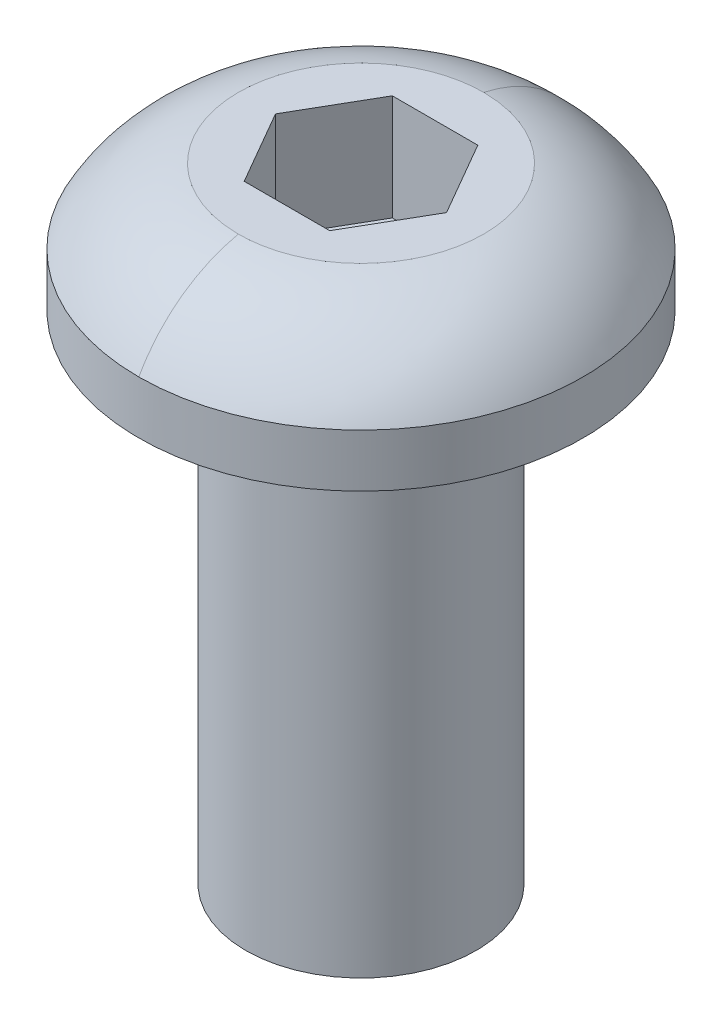
ISO-10303-21;
HEADER;
FILE_DESCRIPTION(('STEP AP214'),'2;1');
FILE_NAME('part.step','',(''),(''),'','','');
FILE_SCHEMA(('AUTOMOTIVE_DESIGN { 1 0 10303 214 1 1 1 1 }'));
ENDSEC;
DATA;
#1=APPLICATION_CONTEXT('core data for automotive mechanical design processes');
#2=APPLICATION_PROTOCOL_DEFINITION('international standard','automotive_design',2000,#1);
#3=PRODUCT_CONTEXT('',#1,'mechanical');
#4=PRODUCT('Part','Part','',(#3));
#5=PRODUCT_RELATED_PRODUCT_CATEGORY('part','',(#4));
#6=PRODUCT_DEFINITION_FORMATION('','',#4);
#7=PRODUCT_DEFINITION_CONTEXT('part definition',#1,'design');
#8=PRODUCT_DEFINITION('design','',#6,#7);
#9=PRODUCT_DEFINITION_SHAPE('','',#8);
#10=(LENGTH_UNIT() NAMED_UNIT(*) SI_UNIT(.MILLI.,.METRE.));
#11=(NAMED_UNIT(*) PLANE_ANGLE_UNIT() SI_UNIT($,.RADIAN.));
#12=(NAMED_UNIT(*) SI_UNIT($,.STERADIAN.) SOLID_ANGLE_UNIT());
#13=UNCERTAINTY_MEASURE_WITH_UNIT(LENGTH_MEASURE(1.E-05),#10,'distance_accuracy_value','');
#14=(GEOMETRIC_REPRESENTATION_CONTEXT(3) GLOBAL_UNCERTAINTY_ASSIGNED_CONTEXT((#13)) GLOBAL_UNIT_ASSIGNED_CONTEXT((#10,
#11,#12)) REPRESENTATION_CONTEXT('',''));
#15=CARTESIAN_POINT('',(0.,0.,0.));
#16=DIRECTION('',(0.,0.,1.));
#17=DIRECTION('',(1.,0.,0.));
#18=AXIS2_PLACEMENT_3D('',#15,#16,#17);
#19=CARTESIAN_POINT('',(-1.4009116,0.,-1.4009116));
#20=DIRECTION('',(0.,1.,0.));
#21=DIRECTION('',(0.,0.,1.));
#22=AXIS2_PLACEMENT_3D('',#19,#20,#21);
#23=PLANE('',#22);
#24=CARTESIAN_POINT('',(0.,0.,0.));
#25=DIRECTION('',(0.,1.,0.));
#26=DIRECTION('',(0.,0.,1.));
#27=AXIS2_PLACEMENT_3D('',#24,#25,#26);
#28=CIRCLE('',#27,1.3843);
#29=CARTESIAN_POINT('',(0.,0.,1.3843));
#30=VERTEX_POINT('',#29);
#31=EDGE_CURVE('E21',#30,#30,#28,.F.);
#32=ORIENTED_EDGE('',*,*,#31,.T.);
#33=EDGE_LOOP('',(#32));
#34=FACE_BOUND('',#33,.T.);
#35=ADVANCED_FACE('F16',(#34),#23,.F.);
#36=CARTESIAN_POINT('',(0.,0.,0.));
#37=DIRECTION('',(0.,1.,0.));
#38=DIRECTION('',(0.,0.,1.));
#39=AXIS2_PLACEMENT_3D('',#36,#37,#38);
#40=CYLINDRICAL_SURFACE('',#39,1.3843);
#41=CARTESIAN_POINT('',(0.,5.969,0.));
#42=DIRECTION('',(0.,1.,0.));
#43=DIRECTION('',(0.,0.,1.));
#44=AXIS2_PLACEMENT_3D('',#41,#42,#43);
#45=CIRCLE('',#44,1.3843);
#46=CARTESIAN_POINT('',(0.,5.969,1.3843));
#47=VERTEX_POINT('',#46);
#48=EDGE_CURVE('E156',#47,#47,#45,.F.);
#49=ORIENTED_EDGE('',*,*,#48,.T.);
#50=EDGE_LOOP('',(#49));
#51=FACE_BOUND('',#50,.T.);
#52=ORIENTED_EDGE('',*,*,#31,.F.);
#53=EDGE_LOOP('',(#52));
#54=FACE_BOUND('',#53,.T.);
#55=ADVANCED_FACE('F141',(#51,#54),#40,.T.);
#56=CARTESIAN_POINT('',(-1.026528779,6.223,-0.889));
#57=DIRECTION('',(0.,1.,0.));
#58=DIRECTION('',(0.,0.,1.));
#59=AXIS2_PLACEMENT_3D('',#56,#57,#58);
#60=PLANE('',#59);
#61=DIRECTION('',(-0.500000000504435,0.,-0.866025403493203));
#62=VECTOR('',#61,1.);
#63=CARTESIAN_POINT('',(0.769896584,6.223,-0.4445));
#64=LINE('',#63,#62);
#65=CARTESIAN_POINT('',(1.02652877885654,6.223,2.48483078188998E-10));
#66=VERTEX_POINT('',#65);
#67=CARTESIAN_POINT('',(0.513264389125,6.223,-0.889));
#68=VERTEX_POINT('',#67);
#69=EDGE_CURVE('E315',#66,#68,#64,.T.);
#70=ORIENTED_EDGE('',*,*,#69,.T.);
#71=DIRECTION('',(-1.,0.,0.));
#72=VECTOR('',#71,1.);
#73=CARTESIAN_POINT('',(0.,6.223,-0.889));
#74=LINE('',#73,#72);
#75=CARTESIAN_POINT('',(-0.513264389125,6.223,-0.889));
#76=VERTEX_POINT('',#75);
#77=EDGE_CURVE('E310',#68,#76,#74,.T.);
#78=ORIENTED_EDGE('',*,*,#77,.T.);
#79=DIRECTION('',(-0.500000000504435,0.,0.866025403493203));
#80=VECTOR('',#79,1.);
#81=CARTESIAN_POINT('',(-0.769896584,6.223,-0.4445));
#82=LINE('',#81,#80);
#83=CARTESIAN_POINT('',(-1.02652877885654,6.223,-2.48483064636471E-10));
#84=VERTEX_POINT('',#83);
#85=EDGE_CURVE('E86',#76,#84,#82,.T.);
#86=ORIENTED_EDGE('',*,*,#85,.T.);
#87=DIRECTION('',(0.500000000504435,0.,0.866025403493203));
#88=VECTOR('',#87,1.);
#89=CARTESIAN_POINT('',(-0.769896584,6.223,0.4445));
#90=LINE('',#89,#88);
#91=CARTESIAN_POINT('',(-0.51326438925,6.223,0.889));
#92=VERTEX_POINT('',#91);
#93=EDGE_CURVE('E80',#84,#92,#90,.T.);
#94=ORIENTED_EDGE('',*,*,#93,.T.);
#95=DIRECTION('',(1.,0.,0.));
#96=VECTOR('',#95,1.);
#97=CARTESIAN_POINT('',(0.,6.223,0.889));
#98=LINE('',#97,#96);
#99=CARTESIAN_POINT('',(0.513264389125,6.223,0.889));
#100=VERTEX_POINT('',#99);
#101=EDGE_CURVE('E83',#92,#100,#98,.T.);
#102=ORIENTED_EDGE('',*,*,#101,.T.);
#103=DIRECTION('',(0.500000000504435,0.,-0.866025403493203));
#104=VECTOR('',#103,1.);
#105=CARTESIAN_POINT('',(0.769896584,6.223,0.4445));
#106=LINE('',#105,#104);
#107=EDGE_CURVE('E316',#100,#66,#106,.T.);
#108=ORIENTED_EDGE('',*,*,#107,.T.);
#109=EDGE_LOOP('',(#70,#78,#86,#94,#102,#108));
#110=FACE_BOUND('',#109,.T.);
#111=ADVANCED_FACE('F82',(#110),#60,.T.);
#112=CARTESIAN_POINT('',(-2.699004,5.969,-2.699004));
#113=DIRECTION('',(0.,1.,0.));
#114=DIRECTION('',(0.,0.,1.));
#115=AXIS2_PLACEMENT_3D('',#112,#113,#114);
#116=PLANE('',#115);
#117=ORIENTED_EDGE('',*,*,#48,.F.);
#118=EDGE_LOOP('',(#117));
#119=FACE_BOUND('',#118,.T.);
#120=CARTESIAN_POINT('',(0.,5.969,0.));
#121=DIRECTION('',(0.,1.,0.));
#122=DIRECTION('',(-1.,0.,0.));
#123=AXIS2_PLACEMENT_3D('',#120,#121,#122);
#124=CIRCLE('',#123,2.667);
#125=CARTESIAN_POINT('',(-2.667,5.969,0.));
#126=VERTEX_POINT('',#125);
#127=EDGE_CURVE('E105',#126,#126,#124,.F.);
#128=ORIENTED_EDGE('',*,*,#127,.T.);
#129=EDGE_LOOP('',(#128));
#130=FACE_BOUND('',#129,.T.);
#131=ADVANCED_FACE('F140',(#119,#130),#116,.F.);
#132=CARTESIAN_POINT('',(0.,7.493,-1.4732));
#133=CARTESIAN_POINT('',(-2.9464,7.493,-1.4732));
#134=CARTESIAN_POINT('',(-2.9464,7.493,1.4732));
#135=CARTESIAN_POINT('',(0.,7.493,1.4732));
#136=CARTESIAN_POINT('',(0.,7.383079007,-1.989919522));
#137=CARTESIAN_POINT('',(-3.979839045,7.383079007,-1.989919522));
#138=CARTESIAN_POINT('',(-3.979839045,7.383079007,1.989919522));
#139=CARTESIAN_POINT('',(0.,7.383079007,1.989919522));
#140=CARTESIAN_POINT('',(0.,7.067554156,-2.413624322));
#141=CARTESIAN_POINT('',(-4.827248645,7.067554156,-2.413624322));
#142=CARTESIAN_POINT('',(-4.827248645,7.067554156,2.413624322));
#143=CARTESIAN_POINT('',(0.,7.067554156,2.413624322));
#144=CARTESIAN_POINT('',(0.,6.604,-2.667));
#145=CARTESIAN_POINT('',(-5.334,6.604,-2.667));
#146=CARTESIAN_POINT('',(-5.334,6.604,2.667));
#147=CARTESIAN_POINT('',(0.,6.604,2.667));
#148=(BOUNDED_SURFACE() B_SPLINE_SURFACE(3,3,((#132,#133,#134,#135),(#136,#137,#138,#139),(#140,
#141,#142,#143),(#144,#145,#146,#147)),.UNSPECIFIED.,.F.,.F.,
.F.) B_SPLINE_SURFACE_WITH_KNOTS((4,4),(4,4),(0.,1.),(0.,1.),
.UNSPECIFIED.) GEOMETRIC_REPRESENTATION_ITEM() RATIONAL_B_SPLINE_SURFACE(((1.,0.333333333333333,
0.333333333333333,1.),(0.939175891277922,0.313058630425974,0.313058630425974,0.939175891277922),
(0.939175891277922,0.313058630425974,0.313058630425974,0.939175891277922),(1.,0.333333333333333,
0.333333333333333,1.))) REPRESENTATION_ITEM('') SURFACE());
#149=CARTESIAN_POINT('',(0.,7.493,1.4732));
#150=CARTESIAN_POINT('',(0.,7.383079007,1.989919522));
#151=CARTESIAN_POINT('',(0.,7.067554156,2.413624322));
#152=CARTESIAN_POINT('',(0.,6.604,2.667));
#153=(BOUNDED_CURVE() B_SPLINE_CURVE(3,(#149,#150,#151,#152),.UNSPECIFIED.,.F.,
.F.) B_SPLINE_CURVE_WITH_KNOTS((4,4),(0.,1.),
.UNSPECIFIED.) CURVE() GEOMETRIC_REPRESENTATION_ITEM() RATIONAL_B_SPLINE_CURVE((1.,
0.939175891277922,0.939175891277922,1.)) REPRESENTATION_ITEM(''));
#154=CARTESIAN_POINT('',(-1.19739803509716E-10,6.604,2.667));
#155=VERTEX_POINT('',#154);
#156=CARTESIAN_POINT('',(0.,7.493,1.4732));
#157=VERTEX_POINT('',#156);
#158=EDGE_CURVE('E34',#155,#157,#153,.F.);
#159=CARTESIAN_POINT('',(0.,7.493,1.4732));
#160=CARTESIAN_POINT('',(-0.041447146561628,7.493,1.47320041445354));
#161=CARTESIAN_POINT('',(-0.082875927499214,7.493,1.47145004746687));
#162=CARTESIAN_POINT('',(-0.16543481673791,7.493,1.46446799362752));
#163=CARTESIAN_POINT('',(-0.206564954977667,7.493,1.45923666074881));
#164=CARTESIAN_POINT('',(-0.328998972429636,7.493,1.43837289399709));
#165=CARTESIAN_POINT('',(-0.409478194154474,7.493,1.41757055027836));
#166=CARTESIAN_POINT('',(-0.565832967990339,7.493,1.3627245956706));
#167=CARTESIAN_POINT('',(-0.641706365292417,7.493,1.32867484141383));
#168=CARTESIAN_POINT('',(-0.750341334126597,7.493,1.26847357595295));
#169=CARTESIAN_POINT('',(-0.785693995784636,7.493,1.24688256644211));
#170=CARTESIAN_POINT('',(-0.854491619935138,7.493,1.20078246773108));
#171=CARTESIAN_POINT('',(-0.887934727475464,7.493,1.17627061020826));
#172=CARTESIAN_POINT('',(-0.984940786419463,7.493,1.09866016715239));
#173=CARTESIAN_POINT('',(-1.04527354467968,7.493,1.04143501498925));
#174=CARTESIAN_POINT('',(-1.15546079579875,7.493,0.917656948814239));
#175=CARTESIAN_POINT('',(-1.20531526854441,7.493,0.851104016897976));
#176=CARTESIAN_POINT('',(-1.27117446988744,7.493,0.745758923002737));
#177=CARTESIAN_POINT('',(-1.29165163845792,7.493,0.709697469636228));
#178=CARTESIAN_POINT('',(-1.3294798282645,7.493,0.636015281040531));
#179=CARTESIAN_POINT('',(-1.34683382712958,7.493,0.598396073529075));
#180=CARTESIAN_POINT('',(-1.39404672295734,7.493,0.483521915512246));
#181=CARTESIAN_POINT('',(-1.41907754296041,7.49299999999999,0.404216726639331));
#182=CARTESIAN_POINT('',(-1.45545571258253,7.49299999999999,0.242568804397365));
#183=CARTESIAN_POINT('',(-1.46680278179041,7.493,0.160226008816478));
#184=CARTESIAN_POINT('',(-1.47551644192995,7.493,-0.00520812093345439));
#185=CARTESIAN_POINT('',(-1.47288271129664,7.493,-0.0882994722757516));
#186=CARTESIAN_POINT('',(-1.45369955324442,7.493,-0.252859154867607));
#187=CARTESIAN_POINT('',(-1.43715026378349,7.493,-0.334327502199329));
#188=CARTESIAN_POINT('',(-1.3906174387999,7.493,-0.493321445243619));
#189=CARTESIAN_POINT('',(-1.3606339458966,7.493,-0.570847053463468));
#190=CARTESIAN_POINT('',(-1.28804661968179,7.493,-0.719797832261786));
#191=CARTESIAN_POINT('',(-1.24544245560989,7.493,-0.791222842893629));
#192=CARTESIAN_POINT('',(-1.17306995581473,7.493,-0.892157994351206));
#193=CARTESIAN_POINT('',(-1.14752942226348,7.493,-0.92477459497586));
#194=CARTESIAN_POINT('',(-1.09376999901085,7.493,-0.987776025996496));
#195=CARTESIAN_POINT('',(-1.06554854836215,7.493,-1.01815867225815));
#196=CARTESIAN_POINT('',(-0.977224287645015,7.493,-1.1055296249634));
#197=CARTESIAN_POINT('',(-0.913396577542671,7.493,-1.1588313961582));
#198=CARTESIAN_POINT('',(-0.777692984409203,7.493,-1.25394481671974));
#199=CARTESIAN_POINT('',(-0.705817407520094,7.493,-1.2957569029469));
#200=CARTESIAN_POINT('',(-0.593529919940853,7.493,-1.34898658926079));
#201=CARTESIAN_POINT('',(-0.555313015546555,7.493,-1.36516026925936));
#202=CARTESIAN_POINT('',(-0.477691083602966,7.493,-1.39421928127026));
#203=CARTESIAN_POINT('',(-0.438287047488784,7.493,-1.40710727662135));
#204=CARTESIAN_POINT('',(-0.318721838805121,7.493,-1.44068050284941));
#205=CARTESIAN_POINT('',(-0.237054821824001,7.493,-1.45634723733141));
#206=CARTESIAN_POINT('',(-0.12906424650258,7.493,-1.46776560141449));
#207=CARTESIAN_POINT('',(-0.103271509982409,7.493,-1.46980448299887));
#208=CARTESIAN_POINT('',(-0.0516571092142996,7.493,-1.47251944457568));
#209=CARTESIAN_POINT('',(-0.0258355632779114,7.493,-1.47319777191838));
#210=CARTESIAN_POINT('',(0.,7.493,-1.4732));
#211=B_SPLINE_CURVE_WITH_KNOTS('',3,(#159,#160,#161,#162,#163,#164,#165,#166,#167,#168,#169,
#170,#171,#172,#173,#174,#175,#176,#177,#178,#179,#180,#181,#182,#183,#184,#185,#186,#187,#188,
#189,#190,#191,#192,#193,#194,#195,#196,#197,#198,#199,#200,#201,#202,#203,#204,#205,#206,#207,
#208,#209,#210),.UNSPECIFIED.,.F.,.F.,(4,2,2,2,2,2,2,2,2,2,2,2,2,2,2,2,2,2,2,2,2,2,2,2,2,4),(0.,
0.124268046025409,0.248523457358717,0.496644137089776,0.744880017973304,0.869024686030341,
0.993287966103402,1.24149923804439,1.48971098642592,1.61399072105521,1.7381513323678,
1.98635490188956,2.23456355758051,2.48277792221184,2.73098982609046,2.97920094253435,
3.22741856462812,3.3515717858115,3.47584482040783,3.72406105005646,3.97226784072969,
4.09663001337576,4.22089105661886,4.46891224347064,4.54651026826476,4.62398001149004),.UNSPECIFIED.);
#212=CARTESIAN_POINT('',(0.,7.493,-1.4732));
#213=VERTEX_POINT('',#212);
#214=EDGE_CURVE('E108',#157,#213,#211,.T.);
#215=CARTESIAN_POINT('',(0.,7.493,-1.4732));
#216=CARTESIAN_POINT('',(0.,7.383079007,-1.989919522));
#217=CARTESIAN_POINT('',(0.,7.067554156,-2.413624322));
#218=CARTESIAN_POINT('',(0.,6.604,-2.667));
#219=(BOUNDED_CURVE() B_SPLINE_CURVE(3,(#215,#216,#217,#218),.UNSPECIFIED.,.F.,
.F.) B_SPLINE_CURVE_WITH_KNOTS((4,4),(0.,1.),
.UNSPECIFIED.) CURVE() GEOMETRIC_REPRESENTATION_ITEM() RATIONAL_B_SPLINE_CURVE((1.,
0.939175891277922,0.939175891277922,1.)) REPRESENTATION_ITEM(''));
#220=CARTESIAN_POINT('',(-4.10258132887791E-10,6.604,-2.667));
#221=VERTEX_POINT('',#220);
#222=EDGE_CURVE('E158',#213,#221,#219,.T.);
#223=CARTESIAN_POINT('',(0.,6.604,0.));
#224=DIRECTION('',(0.,1.,0.));
#225=DIRECTION('',(0.,0.,1.));
#226=AXIS2_PLACEMENT_3D('',#223,#224,#225);
#227=CIRCLE('',#226,2.667);
#228=EDGE_CURVE('E162',#221,#155,#227,.T.);
#229=ORIENTED_EDGE('',*,*,#158,.T.);
#230=ORIENTED_EDGE('',*,*,#214,.T.);
#231=ORIENTED_EDGE('',*,*,#222,.T.);
#232=ORIENTED_EDGE('',*,*,#228,.T.);
#233=EDGE_LOOP('',(#229,#230,#231,#232));
#234=FACE_BOUND('',#233,.T.);
#235=ADVANCED_FACE('F134',(#234),#148,.T.);
#236=CARTESIAN_POINT('',(-0.513264389,6.223,0.889));
#237=DIRECTION('',(0.,0.,1.));
#238=DIRECTION('',(1.,0.,0.));
#239=AXIS2_PLACEMENT_3D('',#236,#237,#238);
#240=PLANE('',#239);
#241=DIRECTION('',(0.,-1.,0.));
#242=VECTOR('',#241,1.);
#243=CARTESIAN_POINT('',(0.513264389,6.858,0.889));
#244=LINE('',#243,#242);
#245=CARTESIAN_POINT('',(0.513264389305377,7.493,0.88899999947107));
#246=VERTEX_POINT('',#245);
#247=EDGE_CURVE('E98',#246,#100,#244,.T.);
#248=ORIENTED_EDGE('',*,*,#247,.T.);
#249=ORIENTED_EDGE('',*,*,#101,.F.);
#250=DIRECTION('',(0.,1.,0.));
#251=VECTOR('',#250,1.);
#252=CARTESIAN_POINT('',(-0.513264389,6.858,0.889));
#253=LINE('',#252,#251);
#254=CARTESIAN_POINT('',(-0.513264389305377,7.493,0.888999999471071));
#255=VERTEX_POINT('',#254);
#256=EDGE_CURVE('E91',#92,#255,#253,.T.);
#257=ORIENTED_EDGE('',*,*,#256,.T.);
#258=DIRECTION('',(1.,0.,0.));
#259=VECTOR('',#258,1.);
#260=CARTESIAN_POINT('',(0.,7.493,0.888999998942141));
#261=LINE('',#260,#259);
#262=EDGE_CURVE('E153',#255,#246,#261,.T.);
#263=ORIENTED_EDGE('',*,*,#262,.T.);
#264=EDGE_LOOP('',(#248,#249,#257,#263));
#265=FACE_BOUND('',#264,.T.);
#266=ADVANCED_FACE('F95',(#265),#240,.F.);
#267=CARTESIAN_POINT('',(0.513264389,6.223,0.889));
#268=DIRECTION('',(0.866025403493203,0.,0.500000000504435));
#269=DIRECTION('',(0.500000000504435,0.,-0.866025403493203));
#270=AXIS2_PLACEMENT_3D('',#267,#268,#269);
#271=PLANE('',#270);
#272=DIRECTION('',(0.,-1.,0.));
#273=VECTOR('',#272,1.);
#274=CARTESIAN_POINT('',(1.026528779,6.858,0.));
#275=LINE('',#274,#273);
#276=CARTESIAN_POINT('',(1.026528779,7.493,0.));
#277=VERTEX_POINT('',#276);
#278=EDGE_CURVE('E312',#277,#66,#275,.T.);
#279=ORIENTED_EDGE('',*,*,#278,.T.);
#280=ORIENTED_EDGE('',*,*,#107,.F.);
#281=ORIENTED_EDGE('',*,*,#247,.F.);
#282=DIRECTION('',(0.500000000504435,0.,-0.866025403493203));
#283=VECTOR('',#282,1.);
#284=CARTESIAN_POINT('',(0.513264389,7.493,0.889));
#285=LINE('',#284,#283);
#286=EDGE_CURVE('E154',#246,#277,#285,.T.);
#287=ORIENTED_EDGE('',*,*,#286,.T.);
#288=EDGE_LOOP('',(#279,#280,#281,#287));
#289=FACE_BOUND('',#288,.T.);
#290=ADVANCED_FACE('F183',(#289),#271,.F.);
#291=CARTESIAN_POINT('',(1.026528779,6.223,0.));
#292=DIRECTION('',(0.866025403493203,0.,-0.500000000504435));
#293=DIRECTION('',(-0.500000000504435,0.,-0.866025403493203));
#294=AXIS2_PLACEMENT_3D('',#291,#292,#293);
#295=PLANE('',#294);
#296=DIRECTION('',(0.,-1.,0.));
#297=VECTOR('',#296,1.);
#298=CARTESIAN_POINT('',(0.513264389,6.858,-0.889));
#299=LINE('',#298,#297);
#300=CARTESIAN_POINT('',(0.513264389305377,7.493,-0.88899999947107));
#301=VERTEX_POINT('',#300);
#302=EDGE_CURVE('E317',#301,#68,#299,.T.);
#303=ORIENTED_EDGE('',*,*,#302,.T.);
#304=ORIENTED_EDGE('',*,*,#69,.F.);
#305=ORIENTED_EDGE('',*,*,#278,.F.);
#306=DIRECTION('',(-0.500000000504435,0.,-0.866025403493203));
#307=VECTOR('',#306,1.);
#308=CARTESIAN_POINT('',(1.026528779,7.493,0.));
#309=LINE('',#308,#307);
#310=EDGE_CURVE('E306',#277,#301,#309,.T.);
#311=ORIENTED_EDGE('',*,*,#310,.T.);
#312=EDGE_LOOP('',(#303,#304,#305,#311));
#313=FACE_BOUND('',#312,.T.);
#314=ADVANCED_FACE('F186',(#313),#295,.F.);
#315=CARTESIAN_POINT('',(0.513264389,6.223,-0.889));
#316=DIRECTION('',(0.,0.,-1.));
#317=DIRECTION('',(-1.,0.,0.));
#318=AXIS2_PLACEMENT_3D('',#315,#316,#317);
#319=PLANE('',#318);
#320=DIRECTION('',(0.,-1.,0.));
#321=VECTOR('',#320,1.);
#322=CARTESIAN_POINT('',(-0.513264389,6.858,-0.889));
#323=LINE('',#322,#321);
#324=CARTESIAN_POINT('',(-0.513264389305377,7.493,-0.88899999947107));
#325=VERTEX_POINT('',#324);
#326=EDGE_CURVE('E307',#325,#76,#323,.T.);
#327=ORIENTED_EDGE('',*,*,#326,.T.);
#328=ORIENTED_EDGE('',*,*,#77,.F.);
#329=ORIENTED_EDGE('',*,*,#302,.F.);
#330=DIRECTION('',(-1.,0.,0.));
#331=VECTOR('',#330,1.);
#332=CARTESIAN_POINT('',(0.,7.493,-0.888999998942141));
#333=LINE('',#332,#331);
#334=EDGE_CURVE('E304',#301,#325,#333,.T.);
#335=ORIENTED_EDGE('',*,*,#334,.T.);
#336=EDGE_LOOP('',(#327,#328,#329,#335));
#337=FACE_BOUND('',#336,.T.);
#338=ADVANCED_FACE('F190',(#337),#319,.F.);
#339=CARTESIAN_POINT('',(-0.513264389,6.223,-0.889));
#340=DIRECTION('',(-0.866025403493203,0.,-0.500000000504435));
#341=DIRECTION('',(-0.500000000504435,0.,0.866025403493203));
#342=AXIS2_PLACEMENT_3D('',#339,#340,#341);
#343=PLANE('',#342);
#344=DIRECTION('',(0.,-1.,0.));
#345=VECTOR('',#344,1.);
#346=CARTESIAN_POINT('',(-1.026528779,6.858,0.));
#347=LINE('',#346,#345);
#348=CARTESIAN_POINT('',(-1.026528779,7.493,0.));
#349=VERTEX_POINT('',#348);
#350=EDGE_CURVE('E92',#349,#84,#347,.T.);
#351=ORIENTED_EDGE('',*,*,#350,.T.);
#352=ORIENTED_EDGE('',*,*,#85,.F.);
#353=ORIENTED_EDGE('',*,*,#326,.F.);
#354=DIRECTION('',(-0.500000000504435,0.,0.866025403493203));
#355=VECTOR('',#354,1.);
#356=CARTESIAN_POINT('',(-0.513264389,7.493,-0.889));
#357=LINE('',#356,#355);
#358=EDGE_CURVE('E291',#325,#349,#357,.T.);
#359=ORIENTED_EDGE('',*,*,#358,.T.);
#360=EDGE_LOOP('',(#351,#352,#353,#359));
#361=FACE_BOUND('',#360,.T.);
#362=ADVANCED_FACE('F194',(#361),#343,.F.);
#363=CARTESIAN_POINT('',(-1.026528779,6.223,0.));
#364=DIRECTION('',(-0.866025403493203,0.,0.500000000504435));
#365=DIRECTION('',(0.500000000504435,0.,0.866025403493203));
#366=AXIS2_PLACEMENT_3D('',#363,#364,#365);
#367=PLANE('',#366);
#368=ORIENTED_EDGE('',*,*,#256,.F.);
#369=ORIENTED_EDGE('',*,*,#93,.F.);
#370=ORIENTED_EDGE('',*,*,#350,.F.);
#371=DIRECTION('',(0.500000000504435,0.,0.866025403493203));
#372=VECTOR('',#371,1.);
#373=CARTESIAN_POINT('',(-1.026528779,7.493,0.));
#374=LINE('',#373,#372);
#375=EDGE_CURVE('E103',#349,#255,#374,.T.);
#376=ORIENTED_EDGE('',*,*,#375,.T.);
#377=EDGE_LOOP('',(#368,#369,#370,#376));
#378=FACE_BOUND('',#377,.T.);
#379=ADVANCED_FACE('F101',(#378),#367,.F.);
#380=CARTESIAN_POINT('',(0.,5.969,0.));
#381=DIRECTION('',(0.,1.,0.));
#382=DIRECTION('',(-1.,0.,0.));
#383=AXIS2_PLACEMENT_3D('',#380,#381,#382);
#384=CYLINDRICAL_SURFACE('',#383,2.667);
#385=ORIENTED_EDGE('',*,*,#127,.F.);
#386=EDGE_LOOP('',(#385));
#387=FACE_BOUND('',#386,.T.);
#388=CARTESIAN_POINT('',(0.,6.604,0.));
#389=DIRECTION('',(0.,1.,0.));
#390=DIRECTION('',(0.,0.,1.));
#391=AXIS2_PLACEMENT_3D('',#388,#389,#390);
#392=CIRCLE('',#391,2.667);
#393=EDGE_CURVE('E27',#155,#221,#392,.T.);
#394=ORIENTED_EDGE('',*,*,#393,.F.);
#395=ORIENTED_EDGE('',*,*,#228,.F.);
#396=EDGE_LOOP('',(#394,#395));
#397=FACE_BOUND('',#396,.T.);
#398=ADVANCED_FACE('F125',(#387,#397),#384,.T.);
#399=CARTESIAN_POINT('',(-1.4908784,7.493,1.4908784));
#400=DIRECTION('',(0.,-1.,0.));
#401=DIRECTION('',(0.,0.,-1.));
#402=AXIS2_PLACEMENT_3D('',#399,#400,#401);
#403=PLANE('',#402);
#404=ORIENTED_EDGE('',*,*,#358,.F.);
#405=ORIENTED_EDGE('',*,*,#334,.F.);
#406=ORIENTED_EDGE('',*,*,#310,.F.);
#407=ORIENTED_EDGE('',*,*,#286,.F.);
#408=ORIENTED_EDGE('',*,*,#262,.F.);
#409=ORIENTED_EDGE('',*,*,#375,.F.);
#410=EDGE_LOOP('',(#404,#405,#406,#407,#408,#409));
#411=FACE_BOUND('',#410,.T.);
#412=ORIENTED_EDGE('',*,*,#214,.F.);
#413=CARTESIAN_POINT('',(0.,7.493,-1.4732));
#414=CARTESIAN_POINT('',(0.041447146561628,7.493,-1.47320041445354));
#415=CARTESIAN_POINT('',(0.082875927499214,7.493,-1.47145004746687));
#416=CARTESIAN_POINT('',(0.16543481673791,7.493,-1.46446799362752));
#417=CARTESIAN_POINT('',(0.206564954977667,7.493,-1.45923666074881));
#418=CARTESIAN_POINT('',(0.328998972429636,7.493,-1.43837289399709));
#419=CARTESIAN_POINT('',(0.409478194154474,7.493,-1.41757055027836));
#420=CARTESIAN_POINT('',(0.565832967990339,7.493,-1.3627245956706));
#421=CARTESIAN_POINT('',(0.641706365292417,7.493,-1.32867484141383));
#422=CARTESIAN_POINT('',(0.750341334126597,7.493,-1.26847357595295));
#423=CARTESIAN_POINT('',(0.785693995784636,7.493,-1.24688256644211));
#424=CARTESIAN_POINT('',(0.854491619935138,7.493,-1.20078246773108));
#425=CARTESIAN_POINT('',(0.887934727475464,7.493,-1.17627061020826));
#426=CARTESIAN_POINT('',(0.984940786419463,7.493,-1.09866016715239));
#427=CARTESIAN_POINT('',(1.04527354467968,7.493,-1.04143501498925));
#428=CARTESIAN_POINT('',(1.15546079579875,7.493,-0.917656948814239));
#429=CARTESIAN_POINT('',(1.20531526854441,7.493,-0.851104016897976));
#430=CARTESIAN_POINT('',(1.27117446988744,7.493,-0.745758923002737));
#431=CARTESIAN_POINT('',(1.29165163845792,7.493,-0.709697469636228));
#432=CARTESIAN_POINT('',(1.3294798282645,7.493,-0.636015281040531));
#433=CARTESIAN_POINT('',(1.34683382712958,7.493,-0.598396073529075));
#434=CARTESIAN_POINT('',(1.39404672295734,7.493,-0.483521915512246));
#435=CARTESIAN_POINT('',(1.41907754296041,7.49299999999999,-0.404216726639331));
#436=CARTESIAN_POINT('',(1.45545571258253,7.49299999999999,-0.242568804397365));
#437=CARTESIAN_POINT('',(1.46680278179041,7.493,-0.160226008816478));
#438=CARTESIAN_POINT('',(1.47551644192995,7.493,0.00520812093345439));
#439=CARTESIAN_POINT('',(1.47288271129664,7.493,0.0882994722757516));
#440=CARTESIAN_POINT('',(1.45369955324442,7.493,0.252859154867607));
#441=CARTESIAN_POINT('',(1.43715026378349,7.493,0.334327502199329));
#442=CARTESIAN_POINT('',(1.3906174387999,7.493,0.493321445243619));
#443=CARTESIAN_POINT('',(1.3606339458966,7.493,0.570847053463468));
#444=CARTESIAN_POINT('',(1.28804661968179,7.493,0.719797832261786));
#445=CARTESIAN_POINT('',(1.24544245560989,7.493,0.791222842893629));
#446=CARTESIAN_POINT('',(1.17306995581473,7.493,0.892157994351206));
#447=CARTESIAN_POINT('',(1.14752942226348,7.493,0.92477459497586));
#448=CARTESIAN_POINT('',(1.09376999901085,7.493,0.987776025996496));
#449=CARTESIAN_POINT('',(1.06554854836215,7.493,1.01815867225815));
#450=CARTESIAN_POINT('',(0.977224287645015,7.493,1.1055296249634));
#451=CARTESIAN_POINT('',(0.913396577542671,7.493,1.1588313961582));
#452=CARTESIAN_POINT('',(0.777692984409203,7.493,1.25394481671974));
#453=CARTESIAN_POINT('',(0.705817407520094,7.493,1.2957569029469));
#454=CARTESIAN_POINT('',(0.593529919940853,7.493,1.34898658926079));
#455=CARTESIAN_POINT('',(0.555313015546555,7.493,1.36516026925936));
#456=CARTESIAN_POINT('',(0.477691083602966,7.493,1.39421928127026));
#457=CARTESIAN_POINT('',(0.438287047488784,7.493,1.40710727662135));
#458=CARTESIAN_POINT('',(0.318721838805121,7.493,1.44068050284941));
#459=CARTESIAN_POINT('',(0.237054821824001,7.493,1.45634723733141));
#460=CARTESIAN_POINT('',(0.12906424650258,7.493,1.46776560141449));
#461=CARTESIAN_POINT('',(0.103271509982409,7.493,1.46980448299887));
#462=CARTESIAN_POINT('',(0.0516571092142996,7.493,1.47251944457568));
#463=CARTESIAN_POINT('',(0.0258355632779114,7.493,1.47319777191838));
#464=CARTESIAN_POINT('',(0.,7.493,1.4732));
#465=B_SPLINE_CURVE_WITH_KNOTS('',3,(#413,#414,#415,#416,#417,#418,#419,#420,#421,#422,#423,
#424,#425,#426,#427,#428,#429,#430,#431,#432,#433,#434,#435,#436,#437,#438,#439,#440,#441,#442,
#443,#444,#445,#446,#447,#448,#449,#450,#451,#452,#453,#454,#455,#456,#457,#458,#459,#460,#461,
#462,#463,#464),.UNSPECIFIED.,.F.,.F.,(4,2,2,2,2,2,2,2,2,2,2,2,2,2,2,2,2,2,2,2,2,2,2,2,2,4),(0.,
0.124268046025409,0.248523457358717,0.496644137089776,0.744880017973304,0.869024686030341,
0.993287966103402,1.24149923804439,1.48971098642592,1.61399072105521,1.7381513323678,
1.98635490188956,2.23456355758051,2.48277792221184,2.73098982609046,2.97920094253435,
3.22741856462812,3.3515717858115,3.47584482040783,3.72406105005646,3.97226784072969,
4.09663001337576,4.22089105661886,4.46891224347064,4.54651026826476,4.62398001149004),.UNSPECIFIED.);
#466=EDGE_CURVE('E10',#213,#157,#465,.T.);
#467=ORIENTED_EDGE('',*,*,#466,.F.);
#468=EDGE_LOOP('',(#412,#467));
#469=FACE_BOUND('',#468,.T.);
#470=ADVANCED_FACE('F18',(#411,#469),#403,.F.);
#471=CARTESIAN_POINT('',(0.,7.493,1.4732));
#472=CARTESIAN_POINT('',(2.9464,7.493,1.4732));
#473=CARTESIAN_POINT('',(2.9464,7.493,-1.4732));
#474=CARTESIAN_POINT('',(0.,7.493,-1.4732));
#475=CARTESIAN_POINT('',(0.,7.383079007,1.989919522));
#476=CARTESIAN_POINT('',(3.979839045,7.383079007,1.989919522));
#477=CARTESIAN_POINT('',(3.979839045,7.383079007,-1.989919522));
#478=CARTESIAN_POINT('',(0.,7.383079007,-1.989919522));
#479=CARTESIAN_POINT('',(0.,7.067554156,2.413624322));
#480=CARTESIAN_POINT('',(4.827248645,7.067554156,2.413624322));
#481=CARTESIAN_POINT('',(4.827248645,7.067554156,-2.413624322));
#482=CARTESIAN_POINT('',(0.,7.067554156,-2.413624322));
#483=CARTESIAN_POINT('',(0.,6.604,2.667));
#484=CARTESIAN_POINT('',(5.334,6.604,2.667));
#485=CARTESIAN_POINT('',(5.334,6.604,-2.667));
#486=CARTESIAN_POINT('',(0.,6.604,-2.667));
#487=(BOUNDED_SURFACE() B_SPLINE_SURFACE(3,3,((#471,#472,#473,#474),(#475,#476,#477,#478),(#479,
#480,#481,#482),(#483,#484,#485,#486)),.UNSPECIFIED.,.F.,.F.,
.F.) B_SPLINE_SURFACE_WITH_KNOTS((4,4),(4,4),(0.,1.),(0.,1.),
.UNSPECIFIED.) GEOMETRIC_REPRESENTATION_ITEM() RATIONAL_B_SPLINE_SURFACE(((1.,0.333333333333333,
0.333333333333333,1.),(0.939175891277922,0.313058630425974,0.313058630425974,0.939175891277922),
(0.939175891277922,0.313058630425974,0.313058630425974,0.939175891277922),(1.,0.333333333333333,
0.333333333333333,1.))) REPRESENTATION_ITEM('') SURFACE());
#488=ORIENTED_EDGE('',*,*,#466,.T.);
#489=ORIENTED_EDGE('',*,*,#158,.F.);
#490=ORIENTED_EDGE('',*,*,#393,.T.);
#491=ORIENTED_EDGE('',*,*,#222,.F.);
#492=EDGE_LOOP('',(#488,#489,#490,#491));
#493=FACE_BOUND('',#492,.T.);
#494=ADVANCED_FACE('F118',(#493),#487,.T.);
#495=CLOSED_SHELL('',(#35,#55,#111,#131,#235,#266,#290,#314,#338,#362,#379,#398,#470,#494));
#496=MANIFOLD_SOLID_BREP('B1',#495);
#497=ADVANCED_BREP_SHAPE_REPRESENTATION('',(#18,#496),#14);
#498=SHAPE_DEFINITION_REPRESENTATION(#9,#497);
ENDSEC;
END-ISO-10303-21;
